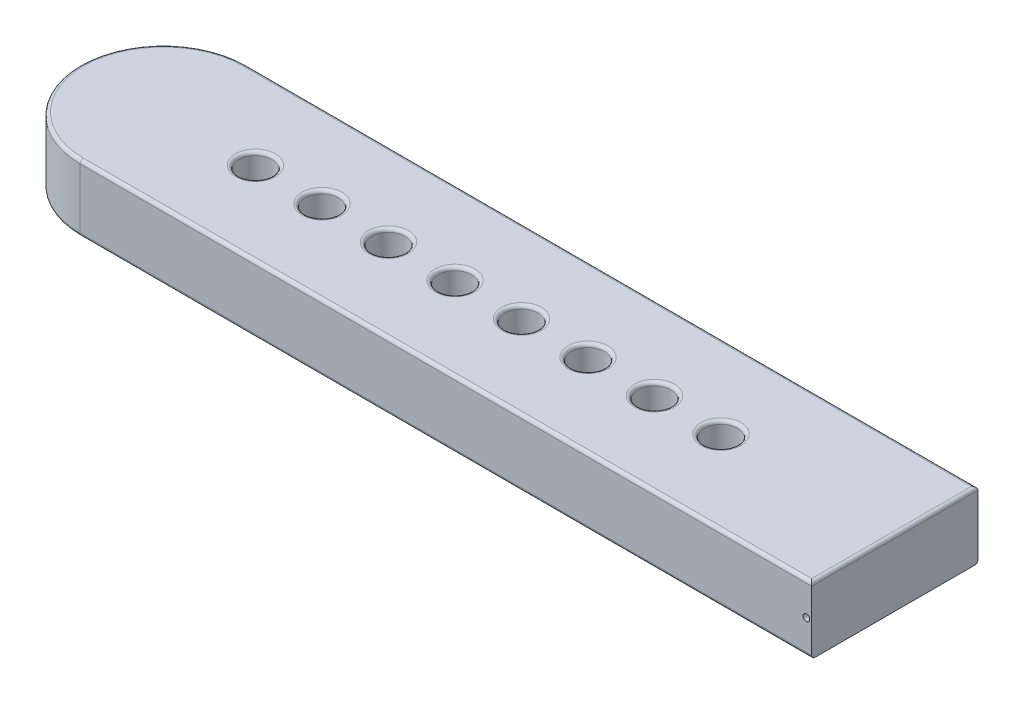
ISO-10303-21;
HEADER;
FILE_DESCRIPTION(('STEP AP214'),'2;1');
FILE_NAME('part.step','',(''),(''),'','','');
FILE_SCHEMA(('AUTOMOTIVE_DESIGN { 1 0 10303 214 1 1 1 1 }'));
ENDSEC;
DATA;
#1=APPLICATION_CONTEXT('core data for automotive mechanical design processes');
#2=APPLICATION_PROTOCOL_DEFINITION('international standard','automotive_design',2000,#1);
#3=PRODUCT_CONTEXT('',#1,'mechanical');
#4=PRODUCT('Part','Part','',(#3));
#5=PRODUCT_RELATED_PRODUCT_CATEGORY('part','',(#4));
#6=PRODUCT_DEFINITION_FORMATION('','',#4);
#7=PRODUCT_DEFINITION_CONTEXT('part definition',#1,'design');
#8=PRODUCT_DEFINITION('design','',#6,#7);
#9=PRODUCT_DEFINITION_SHAPE('','',#8);
#10=(LENGTH_UNIT() NAMED_UNIT(*) SI_UNIT(.MILLI.,.METRE.));
#11=(NAMED_UNIT(*) PLANE_ANGLE_UNIT() SI_UNIT($,.RADIAN.));
#12=(NAMED_UNIT(*) SI_UNIT($,.STERADIAN.) SOLID_ANGLE_UNIT());
#13=UNCERTAINTY_MEASURE_WITH_UNIT(LENGTH_MEASURE(1.E-05),#10,'distance_accuracy_value','');
#14=(GEOMETRIC_REPRESENTATION_CONTEXT(3) GLOBAL_UNCERTAINTY_ASSIGNED_CONTEXT((#13)) GLOBAL_UNIT_ASSIGNED_CONTEXT((#10,
#11,#12)) REPRESENTATION_CONTEXT('',''));
#15=CARTESIAN_POINT('',(0.,0.,0.));
#16=DIRECTION('',(0.,0.,1.));
#17=DIRECTION('',(1.,0.,0.));
#18=AXIS2_PLACEMENT_3D('',#15,#16,#17);
#19=CARTESIAN_POINT('',(-11.,1.,-1.25));
#20=DIRECTION('',(0.,1.,0.));
#21=DIRECTION('',(0.,0.,1.));
#22=AXIS2_PLACEMENT_3D('',#19,#20,#21);
#23=PLANE('',#22);
#24=CARTESIAN_POINT('',(-2.61511146001794,1.,-1.25));
#25=DIRECTION('',(0.,1.,0.));
#26=DIRECTION('',(0.,0.,1.));
#27=AXIS2_PLACEMENT_3D('',#24,#25,#26);
#28=CIRCLE('',#27,0.3);
#29=CARTESIAN_POINT('',(-2.61511146001794,1.,-0.95));
#30=VERTEX_POINT('',#29);
#31=EDGE_CURVE('E201',#30,#30,#28,.F.);
#32=ORIENTED_EDGE('',*,*,#31,.T.);
#33=EDGE_LOOP('',(#32));
#34=FACE_BOUND('',#33,.T.);
#35=CARTESIAN_POINT('',(-4.61511146001794,1.,-1.25));
#36=DIRECTION('',(0.,1.,0.));
#37=DIRECTION('',(0.,0.,1.));
#38=AXIS2_PLACEMENT_3D('',#35,#36,#37);
#39=CIRCLE('',#38,0.3);
#40=CARTESIAN_POINT('',(-4.61511146001794,1.,-0.95));
#41=VERTEX_POINT('',#40);
#42=EDGE_CURVE('E205',#41,#41,#39,.F.);
#43=ORIENTED_EDGE('',*,*,#42,.T.);
#44=EDGE_LOOP('',(#43));
#45=FACE_BOUND('',#44,.T.);
#46=CARTESIAN_POINT('',(-6.61511146001794,1.,-1.25));
#47=DIRECTION('',(0.,1.,0.));
#48=DIRECTION('',(0.,0.,1.));
#49=AXIS2_PLACEMENT_3D('',#46,#47,#48);
#50=CIRCLE('',#49,0.3);
#51=CARTESIAN_POINT('',(-6.61511146001794,1.,-0.95));
#52=VERTEX_POINT('',#51);
#53=EDGE_CURVE('E209',#52,#52,#50,.F.);
#54=ORIENTED_EDGE('',*,*,#53,.T.);
#55=EDGE_LOOP('',(#54));
#56=FACE_BOUND('',#55,.T.);
#57=CARTESIAN_POINT('',(-8.61511146001794,1.,-1.25));
#58=DIRECTION('',(0.,1.,0.));
#59=DIRECTION('',(0.,0.,1.));
#60=AXIS2_PLACEMENT_3D('',#57,#58,#59);
#61=CIRCLE('',#60,0.3);
#62=CARTESIAN_POINT('',(-8.61511146001794,1.,-0.95));
#63=VERTEX_POINT('',#62);
#64=EDGE_CURVE('E213',#63,#63,#61,.F.);
#65=ORIENTED_EDGE('',*,*,#64,.T.);
#66=EDGE_LOOP('',(#65));
#67=FACE_BOUND('',#66,.T.);
#68=CARTESIAN_POINT('',(-11.,1.,-1.25));
#69=DIRECTION('',(0.,1.,0.));
#70=DIRECTION('',(0.,0.,1.));
#71=AXIS2_PLACEMENT_3D('',#68,#69,#70);
#72=CIRCLE('',#71,1.2);
#73=CARTESIAN_POINT('',(-11.,1.,-2.45));
#74=VERTEX_POINT('',#73);
#75=CARTESIAN_POINT('',(-11.,1.,-0.0499999999999999));
#76=VERTEX_POINT('',#75);
#77=EDGE_CURVE('E77',#74,#76,#72,.T.);
#78=ORIENTED_EDGE('',*,*,#77,.T.);
#79=DIRECTION('',(1.,0.,0.));
#80=VECTOR('',#79,1.);
#81=CARTESIAN_POINT('',(0.,1.,-0.0499999999999999));
#82=LINE('',#81,#80);
#83=CARTESIAN_POINT('',(-0.0499999999999997,1.,-0.0499999999999999));
#84=VERTEX_POINT('',#83);
#85=EDGE_CURVE('E217',#76,#84,#82,.T.);
#86=ORIENTED_EDGE('',*,*,#85,.T.);
#87=DIRECTION('',(0.,0.,-1.));
#88=VECTOR('',#87,1.);
#89=CARTESIAN_POINT('',(-0.0499999999999997,1.,-2.5));
#90=LINE('',#89,#88);
#91=CARTESIAN_POINT('',(-0.0499999999999997,1.,-2.45));
#92=VERTEX_POINT('',#91);
#93=EDGE_CURVE('E224',#84,#92,#90,.T.);
#94=ORIENTED_EDGE('',*,*,#93,.T.);
#95=DIRECTION('',(-1.,0.,0.));
#96=VECTOR('',#95,1.);
#97=CARTESIAN_POINT('',(-11.,1.,-2.45));
#98=LINE('',#97,#96);
#99=EDGE_CURVE('E82',#92,#74,#98,.T.);
#100=ORIENTED_EDGE('',*,*,#99,.T.);
#101=EDGE_LOOP('',(#78,#86,#94,#100));
#102=FACE_BOUND('',#101,.T.);
#103=CARTESIAN_POINT('',(-9.61511146001794,1.,-1.25));
#104=DIRECTION('',(0.,1.,0.));
#105=DIRECTION('',(0.,0.,1.));
#106=AXIS2_PLACEMENT_3D('',#103,#104,#105);
#107=CIRCLE('',#106,0.3);
#108=CARTESIAN_POINT('',(-9.61511146001794,1.,-0.95));
#109=VERTEX_POINT('',#108);
#110=EDGE_CURVE('E227',#109,#109,#107,.F.);
#111=ORIENTED_EDGE('',*,*,#110,.T.);
#112=EDGE_LOOP('',(#111));
#113=FACE_BOUND('',#112,.T.);
#114=CARTESIAN_POINT('',(-7.61511146001794,1.,-1.25));
#115=DIRECTION('',(0.,1.,0.));
#116=DIRECTION('',(0.,0.,1.));
#117=AXIS2_PLACEMENT_3D('',#114,#115,#116);
#118=CIRCLE('',#117,0.3);
#119=CARTESIAN_POINT('',(-7.61511146001794,1.,-0.95));
#120=VERTEX_POINT('',#119);
#121=EDGE_CURVE('E231',#120,#120,#118,.F.);
#122=ORIENTED_EDGE('',*,*,#121,.T.);
#123=EDGE_LOOP('',(#122));
#124=FACE_BOUND('',#123,.T.);
#125=CARTESIAN_POINT('',(-5.61511146001794,1.,-1.25));
#126=DIRECTION('',(0.,1.,0.));
#127=DIRECTION('',(0.,0.,1.));
#128=AXIS2_PLACEMENT_3D('',#125,#126,#127);
#129=CIRCLE('',#128,0.3);
#130=CARTESIAN_POINT('',(-5.61511146001794,1.,-0.95));
#131=VERTEX_POINT('',#130);
#132=EDGE_CURVE('E235',#131,#131,#129,.F.);
#133=ORIENTED_EDGE('',*,*,#132,.T.);
#134=EDGE_LOOP('',(#133));
#135=FACE_BOUND('',#134,.T.);
#136=CARTESIAN_POINT('',(-3.61511146001794,1.,-1.25));
#137=DIRECTION('',(0.,1.,0.));
#138=DIRECTION('',(0.,0.,1.));
#139=AXIS2_PLACEMENT_3D('',#136,#137,#138);
#140=CIRCLE('',#139,0.3);
#141=CARTESIAN_POINT('',(-3.61511146001794,1.,-0.95));
#142=VERTEX_POINT('',#141);
#143=EDGE_CURVE('E239',#142,#142,#140,.F.);
#144=ORIENTED_EDGE('',*,*,#143,.T.);
#145=EDGE_LOOP('',(#144));
#146=FACE_BOUND('',#145,.T.);
#147=ADVANCED_FACE('F59',(#34,#45,#56,#67,#102,#113,#124,#135,#146),#23,.T.);
#148=CARTESIAN_POINT('',(-11.,0.,-1.25));
#149=DIRECTION('',(0.,1.,0.));
#150=DIRECTION('',(0.,0.,1.));
#151=AXIS2_PLACEMENT_3D('',#148,#149,#150);
#152=PLANE('',#151);
#153=CARTESIAN_POINT('',(-9.61511146001794,0.,-1.25));
#154=DIRECTION('',(0.,1.,0.));
#155=DIRECTION('',(0.,0.,1.));
#156=AXIS2_PLACEMENT_3D('',#153,#154,#155);
#157=CIRCLE('',#156,0.3);
#158=CARTESIAN_POINT('',(-9.61511146001794,0.,-0.95));
#159=VERTEX_POINT('',#158);
#160=EDGE_CURVE('E301',#159,#159,#157,.T.);
#161=ORIENTED_EDGE('',*,*,#160,.T.);
#162=EDGE_LOOP('',(#161));
#163=FACE_BOUND('',#162,.T.);
#164=CARTESIAN_POINT('',(-8.61511146001794,0.,-1.25));
#165=DIRECTION('',(0.,1.,0.));
#166=DIRECTION('',(0.,0.,1.));
#167=AXIS2_PLACEMENT_3D('',#164,#165,#166);
#168=CIRCLE('',#167,0.3);
#169=CARTESIAN_POINT('',(-8.61511146001794,0.,-0.95));
#170=VERTEX_POINT('',#169);
#171=EDGE_CURVE('E305',#170,#170,#168,.T.);
#172=ORIENTED_EDGE('',*,*,#171,.T.);
#173=EDGE_LOOP('',(#172));
#174=FACE_BOUND('',#173,.T.);
#175=CARTESIAN_POINT('',(-7.61511146001794,0.,-1.25));
#176=DIRECTION('',(0.,1.,0.));
#177=DIRECTION('',(0.,0.,1.));
#178=AXIS2_PLACEMENT_3D('',#175,#176,#177);
#179=CIRCLE('',#178,0.3);
#180=CARTESIAN_POINT('',(-7.61511146001794,0.,-0.95));
#181=VERTEX_POINT('',#180);
#182=EDGE_CURVE('E309',#181,#181,#179,.T.);
#183=ORIENTED_EDGE('',*,*,#182,.T.);
#184=EDGE_LOOP('',(#183));
#185=FACE_BOUND('',#184,.T.);
#186=CARTESIAN_POINT('',(-6.61511146001794,0.,-1.25));
#187=DIRECTION('',(0.,1.,0.));
#188=DIRECTION('',(0.,0.,1.));
#189=AXIS2_PLACEMENT_3D('',#186,#187,#188);
#190=CIRCLE('',#189,0.3);
#191=CARTESIAN_POINT('',(-6.61511146001794,0.,-0.95));
#192=VERTEX_POINT('',#191);
#193=EDGE_CURVE('E313',#192,#192,#190,.T.);
#194=ORIENTED_EDGE('',*,*,#193,.T.);
#195=EDGE_LOOP('',(#194));
#196=FACE_BOUND('',#195,.T.);
#197=CARTESIAN_POINT('',(-5.61511146001794,0.,-1.25));
#198=DIRECTION('',(0.,1.,0.));
#199=DIRECTION('',(0.,0.,1.));
#200=AXIS2_PLACEMENT_3D('',#197,#198,#199);
#201=CIRCLE('',#200,0.3);
#202=CARTESIAN_POINT('',(-5.61511146001794,0.,-0.95));
#203=VERTEX_POINT('',#202);
#204=EDGE_CURVE('E317',#203,#203,#201,.T.);
#205=ORIENTED_EDGE('',*,*,#204,.T.);
#206=EDGE_LOOP('',(#205));
#207=FACE_BOUND('',#206,.T.);
#208=CARTESIAN_POINT('',(-4.61511146001794,0.,-1.25));
#209=DIRECTION('',(0.,1.,0.));
#210=DIRECTION('',(0.,0.,1.));
#211=AXIS2_PLACEMENT_3D('',#208,#209,#210);
#212=CIRCLE('',#211,0.3);
#213=CARTESIAN_POINT('',(-4.61511146001794,0.,-0.95));
#214=VERTEX_POINT('',#213);
#215=EDGE_CURVE('E321',#214,#214,#212,.T.);
#216=ORIENTED_EDGE('',*,*,#215,.T.);
#217=EDGE_LOOP('',(#216));
#218=FACE_BOUND('',#217,.T.);
#219=CARTESIAN_POINT('',(-2.61511146001794,0.,-1.25));
#220=DIRECTION('',(0.,1.,0.));
#221=DIRECTION('',(0.,0.,1.));
#222=AXIS2_PLACEMENT_3D('',#219,#220,#221);
#223=CIRCLE('',#222,0.3);
#224=CARTESIAN_POINT('',(-2.61511146001794,0.,-0.95));
#225=VERTEX_POINT('',#224);
#226=EDGE_CURVE('E325',#225,#225,#223,.T.);
#227=ORIENTED_EDGE('',*,*,#226,.T.);
#228=EDGE_LOOP('',(#227));
#229=FACE_BOUND('',#228,.T.);
#230=CARTESIAN_POINT('',(-3.61511146001794,0.,-1.25));
#231=DIRECTION('',(0.,1.,0.));
#232=DIRECTION('',(0.,0.,1.));
#233=AXIS2_PLACEMENT_3D('',#230,#231,#232);
#234=CIRCLE('',#233,0.3);
#235=CARTESIAN_POINT('',(-3.61511146001794,0.,-0.95));
#236=VERTEX_POINT('',#235);
#237=EDGE_CURVE('E329',#236,#236,#234,.T.);
#238=ORIENTED_EDGE('',*,*,#237,.T.);
#239=EDGE_LOOP('',(#238));
#240=FACE_BOUND('',#239,.T.);
#241=CARTESIAN_POINT('',(-11.,0.,-1.25));
#242=DIRECTION('',(0.,1.,0.));
#243=DIRECTION('',(0.,0.,1.));
#244=AXIS2_PLACEMENT_3D('',#241,#242,#243);
#245=CIRCLE('',#244,1.2);
#246=CARTESIAN_POINT('',(-11.,0.,-0.05));
#247=VERTEX_POINT('',#246);
#248=CARTESIAN_POINT('',(-11.,0.,-2.45));
#249=VERTEX_POINT('',#248);
#250=EDGE_CURVE('E336',#247,#249,#245,.F.);
#251=ORIENTED_EDGE('',*,*,#250,.T.);
#252=DIRECTION('',(-1.,0.,0.));
#253=VECTOR('',#252,1.);
#254=CARTESIAN_POINT('',(-11.,0.,-2.45));
#255=LINE('',#254,#253);
#256=CARTESIAN_POINT('',(0.,0.,-2.45));
#257=VERTEX_POINT('',#256);
#258=EDGE_CURVE('E333',#249,#257,#255,.F.);
#259=ORIENTED_EDGE('',*,*,#258,.T.);
#260=DIRECTION('',(0.,0.,-1.));
#261=VECTOR('',#260,1.);
#262=CARTESIAN_POINT('',(0.,0.,0.));
#263=LINE('',#262,#261);
#264=CARTESIAN_POINT('',(0.,0.,-0.05));
#265=VERTEX_POINT('',#264);
#266=EDGE_CURVE('E182',#265,#257,#263,.T.);
#267=ORIENTED_EDGE('',*,*,#266,.F.);
#268=DIRECTION('',(1.,0.,0.));
#269=VECTOR('',#268,1.);
#270=CARTESIAN_POINT('',(-11.,0.,-0.0499999999999999));
#271=LINE('',#270,#269);
#272=EDGE_CURVE('E339',#265,#247,#271,.F.);
#273=ORIENTED_EDGE('',*,*,#272,.T.);
#274=EDGE_LOOP('',(#251,#259,#267,#273));
#275=FACE_BOUND('',#274,.T.);
#276=ADVANCED_FACE('F388',(#163,#174,#185,#196,#207,#218,#229,#240,#275),#152,.F.);
#277=CARTESIAN_POINT('',(0.,1.,0.));
#278=DIRECTION('',(-1.,0.,0.));
#279=DIRECTION('',(0.,0.,1.));
#280=AXIS2_PLACEMENT_3D('',#277,#278,#279);
#281=PLANE('',#280);
#282=ORIENTED_EDGE('',*,*,#266,.T.);
#283=CARTESIAN_POINT('',(0.,0.05,-2.45));
#284=DIRECTION('',(-1.,0.,0.));
#285=DIRECTION('',(0.,0.,1.));
#286=AXIS2_PLACEMENT_3D('',#283,#284,#285);
#287=CIRCLE('',#286,0.05);
#288=CARTESIAN_POINT('',(0.,0.05,-2.5));
#289=VERTEX_POINT('',#288);
#290=EDGE_CURVE('E292',#257,#289,#287,.F.);
#291=ORIENTED_EDGE('',*,*,#290,.T.);
#292=DIRECTION('',(0.,-1.,0.));
#293=VECTOR('',#292,1.);
#294=CARTESIAN_POINT('',(0.,1.,-2.5));
#295=LINE('',#294,#293);
#296=CARTESIAN_POINT('',(0.,0.95,-2.5));
#297=VERTEX_POINT('',#296);
#298=EDGE_CURVE('E151',#297,#289,#295,.T.);
#299=ORIENTED_EDGE('',*,*,#298,.F.);
#300=DIRECTION('',(0.,0.,-1.));
#301=VECTOR('',#300,1.);
#302=CARTESIAN_POINT('',(0.,0.95,0.));
#303=LINE('',#302,#301);
#304=CARTESIAN_POINT('',(0.,0.95,0.));
#305=VERTEX_POINT('',#304);
#306=EDGE_CURVE('E295',#297,#305,#303,.F.);
#307=ORIENTED_EDGE('',*,*,#306,.T.);
#308=DIRECTION('',(0.,-1.,0.));
#309=VECTOR('',#308,1.);
#310=CARTESIAN_POINT('',(0.,1.,0.));
#311=LINE('',#310,#309);
#312=CARTESIAN_POINT('',(0.,0.05,0.));
#313=VERTEX_POINT('',#312);
#314=EDGE_CURVE('E348',#305,#313,#311,.T.);
#315=ORIENTED_EDGE('',*,*,#314,.T.);
#316=CARTESIAN_POINT('',(0.,0.05,-0.05));
#317=DIRECTION('',(-1.,0.,0.));
#318=DIRECTION('',(0.,0.,1.));
#319=AXIS2_PLACEMENT_3D('',#316,#317,#318);
#320=CIRCLE('',#319,0.05);
#321=EDGE_CURVE('E298',#313,#265,#320,.F.);
#322=ORIENTED_EDGE('',*,*,#321,.T.);
#323=EDGE_LOOP('',(#282,#291,#299,#307,#315,#322));
#324=FACE_BOUND('',#323,.T.);
#325=ADVANCED_FACE('F422',(#324),#281,.F.);
#326=CARTESIAN_POINT('',(0.,1.,-2.5));
#327=DIRECTION('',(0.,0.,1.));
#328=DIRECTION('',(1.,0.,0.));
#329=AXIS2_PLACEMENT_3D('',#326,#327,#328);
#330=PLANE('',#329);
#331=CARTESIAN_POINT('',(-0.08,0.50222740681197,-2.5));
#332=DIRECTION('',(0.,0.,1.));
#333=DIRECTION('',(1.,0.,0.));
#334=AXIS2_PLACEMENT_3D('',#331,#332,#333);
#335=CIRCLE('',#334,0.05);
#336=CARTESIAN_POINT('',(-0.03,0.50222740681197,-2.5));
#337=VERTEX_POINT('',#336);
#338=EDGE_CURVE('E179',#337,#337,#335,.T.);
#339=ORIENTED_EDGE('',*,*,#338,.T.);
#340=EDGE_LOOP('',(#339));
#341=FACE_BOUND('',#340,.T.);
#342=ORIENTED_EDGE('',*,*,#298,.T.);
#343=DIRECTION('',(-1.,0.,0.));
#344=VECTOR('',#343,1.);
#345=CARTESIAN_POINT('',(0.,0.05,-2.5));
#346=LINE('',#345,#344);
#347=CARTESIAN_POINT('',(-11.,0.05,-2.5));
#348=VERTEX_POINT('',#347);
#349=EDGE_CURVE('E149',#289,#348,#346,.T.);
#350=ORIENTED_EDGE('',*,*,#349,.T.);
#351=DIRECTION('',(0.,-1.,0.));
#352=VECTOR('',#351,1.);
#353=CARTESIAN_POINT('',(-11.,1.,-2.5));
#354=LINE('',#353,#352);
#355=CARTESIAN_POINT('',(-11.,0.95,-2.5));
#356=VERTEX_POINT('',#355);
#357=EDGE_CURVE('E131',#356,#348,#354,.T.);
#358=ORIENTED_EDGE('',*,*,#357,.F.);
#359=DIRECTION('',(-1.,0.,0.));
#360=VECTOR('',#359,1.);
#361=CARTESIAN_POINT('',(0.,0.95,-2.5));
#362=LINE('',#361,#360);
#363=EDGE_CURVE('E146',#356,#297,#362,.F.);
#364=ORIENTED_EDGE('',*,*,#363,.T.);
#365=EDGE_LOOP('',(#342,#350,#358,#364));
#366=FACE_BOUND('',#365,.T.);
#367=ADVANCED_FACE('F145',(#341,#366),#330,.F.);
#368=CARTESIAN_POINT('',(-11.,1.,-1.25));
#369=DIRECTION('',(0.,-1.,0.));
#370=DIRECTION('',(0.,0.,-1.));
#371=AXIS2_PLACEMENT_3D('',#368,#369,#370);
#372=CYLINDRICAL_SURFACE('',#371,1.25);
#373=ORIENTED_EDGE('',*,*,#357,.T.);
#374=CARTESIAN_POINT('',(-11.,0.05,-1.25));
#375=DIRECTION('',(0.,1.,0.));
#376=DIRECTION('',(0.,0.,1.));
#377=AXIS2_PLACEMENT_3D('',#374,#375,#376);
#378=CIRCLE('',#377,1.25);
#379=CARTESIAN_POINT('',(-11.,0.05,0.));
#380=VERTEX_POINT('',#379);
#381=EDGE_CURVE('E138',#348,#380,#378,.T.);
#382=ORIENTED_EDGE('',*,*,#381,.T.);
#383=DIRECTION('',(0.,-1.,0.));
#384=VECTOR('',#383,1.);
#385=CARTESIAN_POINT('',(-11.,1.,0.));
#386=LINE('',#385,#384);
#387=CARTESIAN_POINT('',(-11.,0.95,0.));
#388=VERTEX_POINT('',#387);
#389=EDGE_CURVE('E133',#388,#380,#386,.T.);
#390=ORIENTED_EDGE('',*,*,#389,.F.);
#391=CARTESIAN_POINT('',(-11.,0.95,-1.25));
#392=DIRECTION('',(0.,1.,0.));
#393=DIRECTION('',(0.,0.,1.));
#394=AXIS2_PLACEMENT_3D('',#391,#392,#393);
#395=CIRCLE('',#394,1.25);
#396=EDGE_CURVE('E128',#388,#356,#395,.F.);
#397=ORIENTED_EDGE('',*,*,#396,.T.);
#398=EDGE_LOOP('',(#373,#382,#390,#397));
#399=FACE_BOUND('',#398,.T.);
#400=ADVANCED_FACE('F130',(#399),#372,.T.);
#401=CARTESIAN_POINT('',(-11.,1.,0.));
#402=DIRECTION('',(0.,0.,-1.));
#403=DIRECTION('',(-1.,0.,0.));
#404=AXIS2_PLACEMENT_3D('',#401,#402,#403);
#405=PLANE('',#404);
#406=CARTESIAN_POINT('',(-0.08,0.50222740681197,0.));
#407=DIRECTION('',(0.,0.,1.));
#408=DIRECTION('',(1.,0.,0.));
#409=AXIS2_PLACEMENT_3D('',#406,#407,#408);
#410=CIRCLE('',#409,0.05);
#411=CARTESIAN_POINT('',(-0.03,0.50222740681197,0.));
#412=VERTEX_POINT('',#411);
#413=EDGE_CURVE('E355',#412,#412,#410,.T.);
#414=ORIENTED_EDGE('',*,*,#413,.F.);
#415=EDGE_LOOP('',(#414));
#416=FACE_BOUND('',#415,.T.);
#417=ORIENTED_EDGE('',*,*,#314,.F.);
#418=DIRECTION('',(1.,0.,0.));
#419=VECTOR('',#418,1.);
#420=CARTESIAN_POINT('',(-11.,0.95,0.));
#421=LINE('',#420,#419);
#422=EDGE_CURVE('E187',#305,#388,#421,.F.);
#423=ORIENTED_EDGE('',*,*,#422,.T.);
#424=ORIENTED_EDGE('',*,*,#389,.T.);
#425=DIRECTION('',(1.,0.,0.));
#426=VECTOR('',#425,1.);
#427=CARTESIAN_POINT('',(-11.,0.05,0.));
#428=LINE('',#427,#426);
#429=EDGE_CURVE('E190',#380,#313,#428,.T.);
#430=ORIENTED_EDGE('',*,*,#429,.T.);
#431=EDGE_LOOP('',(#417,#423,#424,#430));
#432=FACE_BOUND('',#431,.T.);
#433=ADVANCED_FACE('F371',(#416,#432),#405,.F.);
#434=CARTESIAN_POINT('',(-9.61511146001794,1.,-1.25));
#435=DIRECTION('',(0.,-1.,0.));
#436=DIRECTION('',(0.,0.,-1.));
#437=AXIS2_PLACEMENT_3D('',#434,#435,#436);
#438=CYLINDRICAL_SURFACE('',#437,0.25);
#439=CARTESIAN_POINT('',(-9.61511146001794,0.05,-1.25));
#440=DIRECTION('',(0.,1.,0.));
#441=DIRECTION('',(0.,0.,1.));
#442=AXIS2_PLACEMENT_3D('',#439,#440,#441);
#443=CIRCLE('',#442,0.25);
#444=CARTESIAN_POINT('',(-9.61511146001794,0.05,-1.));
#445=VERTEX_POINT('',#444);
#446=EDGE_CURVE('E284',#445,#445,#443,.F.);
#447=ORIENTED_EDGE('',*,*,#446,.T.);
#448=EDGE_LOOP('',(#447));
#449=FACE_BOUND('',#448,.T.);
#450=CARTESIAN_POINT('',(-9.61511146001794,0.95,-1.25));
#451=DIRECTION('',(0.,1.,0.));
#452=DIRECTION('',(0.,0.,1.));
#453=AXIS2_PLACEMENT_3D('',#450,#451,#452);
#454=CIRCLE('',#453,0.25);
#455=CARTESIAN_POINT('',(-9.61511146001794,0.95,-1.));
#456=VERTEX_POINT('',#455);
#457=EDGE_CURVE('E288',#456,#456,#454,.T.);
#458=ORIENTED_EDGE('',*,*,#457,.T.);
#459=EDGE_LOOP('',(#458));
#460=FACE_BOUND('',#459,.T.);
#461=ADVANCED_FACE('F374',(#449,#460),#438,.F.);
#462=CARTESIAN_POINT('',(-8.61511146001794,1.,-1.25));
#463=DIRECTION('',(0.,-1.,0.));
#464=DIRECTION('',(0.,0.,-1.));
#465=AXIS2_PLACEMENT_3D('',#462,#463,#464);
#466=CYLINDRICAL_SURFACE('',#465,0.25);
#467=CARTESIAN_POINT('',(-8.61511146001794,0.05,-1.25));
#468=DIRECTION('',(0.,1.,0.));
#469=DIRECTION('',(0.,0.,1.));
#470=AXIS2_PLACEMENT_3D('',#467,#468,#469);
#471=CIRCLE('',#470,0.25);
#472=CARTESIAN_POINT('',(-8.61511146001794,0.05,-1.));
#473=VERTEX_POINT('',#472);
#474=EDGE_CURVE('E276',#473,#473,#471,.F.);
#475=ORIENTED_EDGE('',*,*,#474,.T.);
#476=EDGE_LOOP('',(#475));
#477=FACE_BOUND('',#476,.T.);
#478=CARTESIAN_POINT('',(-8.61511146001794,0.95,-1.25));
#479=DIRECTION('',(0.,1.,0.));
#480=DIRECTION('',(0.,0.,1.));
#481=AXIS2_PLACEMENT_3D('',#478,#479,#480);
#482=CIRCLE('',#481,0.25);
#483=CARTESIAN_POINT('',(-8.61511146001794,0.95,-1.));
#484=VERTEX_POINT('',#483);
#485=EDGE_CURVE('E280',#484,#484,#482,.T.);
#486=ORIENTED_EDGE('',*,*,#485,.T.);
#487=EDGE_LOOP('',(#486));
#488=FACE_BOUND('',#487,.T.);
#489=ADVANCED_FACE('F540',(#477,#488),#466,.F.);
#490=CARTESIAN_POINT('',(-7.61511146001794,1.,-1.25));
#491=DIRECTION('',(0.,-1.,0.));
#492=DIRECTION('',(0.,0.,-1.));
#493=AXIS2_PLACEMENT_3D('',#490,#491,#492);
#494=CYLINDRICAL_SURFACE('',#493,0.25);
#495=CARTESIAN_POINT('',(-7.61511146001794,0.05,-1.25));
#496=DIRECTION('',(0.,1.,0.));
#497=DIRECTION('',(0.,0.,1.));
#498=AXIS2_PLACEMENT_3D('',#495,#496,#497);
#499=CIRCLE('',#498,0.25);
#500=CARTESIAN_POINT('',(-7.61511146001794,0.05,-1.));
#501=VERTEX_POINT('',#500);
#502=EDGE_CURVE('E268',#501,#501,#499,.F.);
#503=ORIENTED_EDGE('',*,*,#502,.T.);
#504=EDGE_LOOP('',(#503));
#505=FACE_BOUND('',#504,.T.);
#506=CARTESIAN_POINT('',(-7.61511146001794,0.95,-1.25));
#507=DIRECTION('',(0.,1.,0.));
#508=DIRECTION('',(0.,0.,1.));
#509=AXIS2_PLACEMENT_3D('',#506,#507,#508);
#510=CIRCLE('',#509,0.25);
#511=CARTESIAN_POINT('',(-7.61511146001794,0.95,-1.));
#512=VERTEX_POINT('',#511);
#513=EDGE_CURVE('E272',#512,#512,#510,.T.);
#514=ORIENTED_EDGE('',*,*,#513,.T.);
#515=EDGE_LOOP('',(#514));
#516=FACE_BOUND('',#515,.T.);
#517=ADVANCED_FACE('F536',(#505,#516),#494,.F.);
#518=CARTESIAN_POINT('',(-6.61511146001794,1.,-1.25));
#519=DIRECTION('',(0.,-1.,0.));
#520=DIRECTION('',(0.,0.,-1.));
#521=AXIS2_PLACEMENT_3D('',#518,#519,#520);
#522=CYLINDRICAL_SURFACE('',#521,0.25);
#523=CARTESIAN_POINT('',(-6.61511146001794,0.05,-1.25));
#524=DIRECTION('',(0.,1.,0.));
#525=DIRECTION('',(0.,0.,1.));
#526=AXIS2_PLACEMENT_3D('',#523,#524,#525);
#527=CIRCLE('',#526,0.25);
#528=CARTESIAN_POINT('',(-6.61511146001794,0.05,-1.));
#529=VERTEX_POINT('',#528);
#530=EDGE_CURVE('E260',#529,#529,#527,.F.);
#531=ORIENTED_EDGE('',*,*,#530,.T.);
#532=EDGE_LOOP('',(#531));
#533=FACE_BOUND('',#532,.T.);
#534=CARTESIAN_POINT('',(-6.61511146001794,0.95,-1.25));
#535=DIRECTION('',(0.,1.,0.));
#536=DIRECTION('',(0.,0.,1.));
#537=AXIS2_PLACEMENT_3D('',#534,#535,#536);
#538=CIRCLE('',#537,0.25);
#539=CARTESIAN_POINT('',(-6.61511146001794,0.95,-1.));
#540=VERTEX_POINT('',#539);
#541=EDGE_CURVE('E264',#540,#540,#538,.T.);
#542=ORIENTED_EDGE('',*,*,#541,.T.);
#543=EDGE_LOOP('',(#542));
#544=FACE_BOUND('',#543,.T.);
#545=ADVANCED_FACE('F532',(#533,#544),#522,.F.);
#546=CARTESIAN_POINT('',(-5.61511146001794,1.,-1.25));
#547=DIRECTION('',(0.,-1.,0.));
#548=DIRECTION('',(0.,0.,-1.));
#549=AXIS2_PLACEMENT_3D('',#546,#547,#548);
#550=CYLINDRICAL_SURFACE('',#549,0.25);
#551=CARTESIAN_POINT('',(-5.61511146001794,0.05,-1.25));
#552=DIRECTION('',(0.,1.,0.));
#553=DIRECTION('',(0.,0.,1.));
#554=AXIS2_PLACEMENT_3D('',#551,#552,#553);
#555=CIRCLE('',#554,0.25);
#556=CARTESIAN_POINT('',(-5.61511146001794,0.05,-1.));
#557=VERTEX_POINT('',#556);
#558=EDGE_CURVE('E139',#557,#557,#555,.F.);
#559=ORIENTED_EDGE('',*,*,#558,.T.);
#560=EDGE_LOOP('',(#559));
#561=FACE_BOUND('',#560,.T.);
#562=CARTESIAN_POINT('',(-5.61511146001794,0.95,-1.25));
#563=DIRECTION('',(0.,1.,0.));
#564=DIRECTION('',(0.,0.,1.));
#565=AXIS2_PLACEMENT_3D('',#562,#563,#564);
#566=CIRCLE('',#565,0.25);
#567=CARTESIAN_POINT('',(-5.61511146001794,0.95,-1.));
#568=VERTEX_POINT('',#567);
#569=EDGE_CURVE('E256',#568,#568,#566,.T.);
#570=ORIENTED_EDGE('',*,*,#569,.T.);
#571=EDGE_LOOP('',(#570));
#572=FACE_BOUND('',#571,.T.);
#573=ADVANCED_FACE('F528',(#561,#572),#550,.F.);
#574=CARTESIAN_POINT('',(-4.61511146001794,1.,-1.25));
#575=DIRECTION('',(0.,-1.,0.));
#576=DIRECTION('',(0.,0.,-1.));
#577=AXIS2_PLACEMENT_3D('',#574,#575,#576);
#578=CYLINDRICAL_SURFACE('',#577,0.25);
#579=CARTESIAN_POINT('',(-4.61511146001794,0.95,-1.25));
#580=DIRECTION('',(0.,1.,0.));
#581=DIRECTION('',(0.,0.,1.));
#582=AXIS2_PLACEMENT_3D('',#579,#580,#581);
#583=CIRCLE('',#582,0.25);
#584=CARTESIAN_POINT('',(-4.61511146001794,0.95,-1.));
#585=VERTEX_POINT('',#584);
#586=EDGE_CURVE('E193',#585,#585,#583,.T.);
#587=ORIENTED_EDGE('',*,*,#586,.T.);
#588=EDGE_LOOP('',(#587));
#589=FACE_BOUND('',#588,.T.);
#590=CARTESIAN_POINT('',(-4.61511146001794,0.05,-1.25));
#591=DIRECTION('',(0.,1.,0.));
#592=DIRECTION('',(0.,0.,1.));
#593=AXIS2_PLACEMENT_3D('',#590,#591,#592);
#594=CIRCLE('',#593,0.25);
#595=CARTESIAN_POINT('',(-4.61511146001794,0.05,-1.));
#596=VERTEX_POINT('',#595);
#597=EDGE_CURVE('E197',#596,#596,#594,.F.);
#598=ORIENTED_EDGE('',*,*,#597,.T.);
#599=EDGE_LOOP('',(#598));
#600=FACE_BOUND('',#599,.T.);
#601=ADVANCED_FACE('F411',(#589,#600),#578,.F.);
#602=CARTESIAN_POINT('',(-3.61511146001794,1.,-1.25));
#603=DIRECTION('',(0.,-1.,0.));
#604=DIRECTION('',(0.,0.,-1.));
#605=AXIS2_PLACEMENT_3D('',#602,#603,#604);
#606=CYLINDRICAL_SURFACE('',#605,0.25);
#607=CARTESIAN_POINT('',(-3.61511146001794,0.95,-1.25));
#608=DIRECTION('',(0.,1.,0.));
#609=DIRECTION('',(0.,0.,1.));
#610=AXIS2_PLACEMENT_3D('',#607,#608,#609);
#611=CIRCLE('',#610,0.25);
#612=CARTESIAN_POINT('',(-3.61511146001794,0.95,-1.));
#613=VERTEX_POINT('',#612);
#614=EDGE_CURVE('E13',#613,#613,#611,.T.);
#615=ORIENTED_EDGE('',*,*,#614,.T.);
#616=EDGE_LOOP('',(#615));
#617=FACE_BOUND('',#616,.T.);
#618=CARTESIAN_POINT('',(-3.61511146001794,0.05,-1.25));
#619=DIRECTION('',(0.,1.,0.));
#620=DIRECTION('',(0.,0.,1.));
#621=AXIS2_PLACEMENT_3D('',#618,#619,#620);
#622=CIRCLE('',#621,0.25);
#623=CARTESIAN_POINT('',(-3.61511146001794,0.05,-1.));
#624=VERTEX_POINT('',#623);
#625=EDGE_CURVE('E69',#624,#624,#622,.F.);
#626=ORIENTED_EDGE('',*,*,#625,.T.);
#627=EDGE_LOOP('',(#626));
#628=FACE_BOUND('',#627,.T.);
#629=ADVANCED_FACE('F407',(#617,#628),#606,.F.);
#630=CARTESIAN_POINT('',(-2.61511146001794,1.,-1.25));
#631=DIRECTION('',(0.,-1.,0.));
#632=DIRECTION('',(0.,0.,-1.));
#633=AXIS2_PLACEMENT_3D('',#630,#631,#632);
#634=CYLINDRICAL_SURFACE('',#633,0.25);
#635=CARTESIAN_POINT('',(-2.61511146001794,0.95,-1.25));
#636=DIRECTION('',(0.,1.,0.));
#637=DIRECTION('',(0.,0.,1.));
#638=AXIS2_PLACEMENT_3D('',#635,#636,#637);
#639=CIRCLE('',#638,0.25);
#640=CARTESIAN_POINT('',(-2.61511146001794,0.95,-1.));
#641=VERTEX_POINT('',#640);
#642=EDGE_CURVE('E243',#641,#641,#639,.T.);
#643=ORIENTED_EDGE('',*,*,#642,.T.);
#644=EDGE_LOOP('',(#643));
#645=FACE_BOUND('',#644,.T.);
#646=CARTESIAN_POINT('',(-2.61511146001794,0.05,-1.25));
#647=DIRECTION('',(0.,1.,0.));
#648=DIRECTION('',(0.,0.,1.));
#649=AXIS2_PLACEMENT_3D('',#646,#647,#648);
#650=CIRCLE('',#649,0.25);
#651=CARTESIAN_POINT('',(-2.61511146001794,0.05,-1.));
#652=VERTEX_POINT('',#651);
#653=EDGE_CURVE('E247',#652,#652,#650,.F.);
#654=ORIENTED_EDGE('',*,*,#653,.T.);
#655=EDGE_LOOP('',(#654));
#656=FACE_BOUND('',#655,.T.);
#657=ADVANCED_FACE('F410',(#645,#656),#634,.F.);
#658=CARTESIAN_POINT('',(-11.,0.05,-0.05));
#659=DIRECTION('',(1.,0.,0.));
#660=DIRECTION('',(0.,0.,-1.));
#661=AXIS2_PLACEMENT_3D('',#658,#659,#660);
#662=CYLINDRICAL_SURFACE('',#661,0.05);
#663=ORIENTED_EDGE('',*,*,#321,.F.);
#664=ORIENTED_EDGE('',*,*,#429,.F.);
#665=CARTESIAN_POINT('',(-11.,0.05,-0.05));
#666=DIRECTION('',(-1.,0.,0.));
#667=DIRECTION('',(0.,0.,1.));
#668=AXIS2_PLACEMENT_3D('',#665,#666,#667);
#669=CIRCLE('',#668,0.05);
#670=EDGE_CURVE('E167',#247,#380,#669,.T.);
#671=ORIENTED_EDGE('',*,*,#670,.F.);
#672=ORIENTED_EDGE('',*,*,#272,.F.);
#673=EDGE_LOOP('',(#663,#664,#671,#672));
#674=FACE_BOUND('',#673,.T.);
#675=ADVANCED_FACE('F438',(#674),#662,.T.);
#676=CARTESIAN_POINT('',(-11.,0.05,-1.25));
#677=DIRECTION('',(0.,1.,0.));
#678=DIRECTION('',(0.,0.,1.));
#679=AXIS2_PLACEMENT_3D('',#676,#677,#678);
#680=TOROIDAL_SURFACE('',#679,1.2,0.05);
#681=ORIENTED_EDGE('',*,*,#670,.T.);
#682=ORIENTED_EDGE('',*,*,#381,.F.);
#683=CARTESIAN_POINT('',(-11.,0.05,-2.45));
#684=DIRECTION('',(1.,0.,0.));
#685=DIRECTION('',(0.,0.,-1.));
#686=AXIS2_PLACEMENT_3D('',#683,#684,#685);
#687=CIRCLE('',#686,0.05);
#688=EDGE_CURVE('E163',#249,#348,#687,.T.);
#689=ORIENTED_EDGE('',*,*,#688,.F.);
#690=ORIENTED_EDGE('',*,*,#250,.F.);
#691=EDGE_LOOP('',(#681,#682,#689,#690));
#692=FACE_BOUND('',#691,.T.);
#693=ADVANCED_FACE('F436',(#692),#680,.T.);
#694=CARTESIAN_POINT('',(0.,0.05,-2.45));
#695=DIRECTION('',(-1.,0.,0.));
#696=DIRECTION('',(0.,0.,1.));
#697=AXIS2_PLACEMENT_3D('',#694,#695,#696);
#698=CYLINDRICAL_SURFACE('',#697,0.05);
#699=ORIENTED_EDGE('',*,*,#290,.F.);
#700=ORIENTED_EDGE('',*,*,#258,.F.);
#701=ORIENTED_EDGE('',*,*,#688,.T.);
#702=ORIENTED_EDGE('',*,*,#349,.F.);
#703=EDGE_LOOP('',(#699,#700,#701,#702));
#704=FACE_BOUND('',#703,.T.);
#705=ADVANCED_FACE('F434',(#704),#698,.T.);
#706=CARTESIAN_POINT('',(-9.61511146001794,0.05,-1.25));
#707=DIRECTION('',(0.,1.,0.));
#708=DIRECTION('',(0.,0.,1.));
#709=AXIS2_PLACEMENT_3D('',#706,#707,#708);
#710=TOROIDAL_SURFACE('',#709,0.3,0.05);
#711=ORIENTED_EDGE('',*,*,#446,.F.);
#712=EDGE_LOOP('',(#711));
#713=FACE_BOUND('',#712,.T.);
#714=ORIENTED_EDGE('',*,*,#160,.F.);
#715=EDGE_LOOP('',(#714));
#716=FACE_BOUND('',#715,.T.);
#717=ADVANCED_FACE('F450',(#713,#716),#710,.T.);
#718=CARTESIAN_POINT('',(-8.61511146001794,0.05,-1.25));
#719=DIRECTION('',(0.,1.,0.));
#720=DIRECTION('',(0.,0.,1.));
#721=AXIS2_PLACEMENT_3D('',#718,#719,#720);
#722=TOROIDAL_SURFACE('',#721,0.3,0.05);
#723=ORIENTED_EDGE('',*,*,#474,.F.);
#724=EDGE_LOOP('',(#723));
#725=FACE_BOUND('',#724,.T.);
#726=ORIENTED_EDGE('',*,*,#171,.F.);
#727=EDGE_LOOP('',(#726));
#728=FACE_BOUND('',#727,.T.);
#729=ADVANCED_FACE('F457',(#725,#728),#722,.T.);
#730=CARTESIAN_POINT('',(-7.61511146001794,0.05,-1.25));
#731=DIRECTION('',(0.,1.,0.));
#732=DIRECTION('',(0.,0.,1.));
#733=AXIS2_PLACEMENT_3D('',#730,#731,#732);
#734=TOROIDAL_SURFACE('',#733,0.3,0.05);
#735=ORIENTED_EDGE('',*,*,#502,.F.);
#736=EDGE_LOOP('',(#735));
#737=FACE_BOUND('',#736,.T.);
#738=ORIENTED_EDGE('',*,*,#182,.F.);
#739=EDGE_LOOP('',(#738));
#740=FACE_BOUND('',#739,.T.);
#741=ADVANCED_FACE('F461',(#737,#740),#734,.T.);
#742=CARTESIAN_POINT('',(-6.61511146001794,0.05,-1.25));
#743=DIRECTION('',(0.,1.,0.));
#744=DIRECTION('',(0.,0.,1.));
#745=AXIS2_PLACEMENT_3D('',#742,#743,#744);
#746=TOROIDAL_SURFACE('',#745,0.3,0.05);
#747=ORIENTED_EDGE('',*,*,#530,.F.);
#748=EDGE_LOOP('',(#747));
#749=FACE_BOUND('',#748,.T.);
#750=ORIENTED_EDGE('',*,*,#193,.F.);
#751=EDGE_LOOP('',(#750));
#752=FACE_BOUND('',#751,.T.);
#753=ADVANCED_FACE('F465',(#749,#752),#746,.T.);
#754=CARTESIAN_POINT('',(-5.61511146001794,0.05,-1.25));
#755=DIRECTION('',(0.,1.,0.));
#756=DIRECTION('',(0.,0.,1.));
#757=AXIS2_PLACEMENT_3D('',#754,#755,#756);
#758=TOROIDAL_SURFACE('',#757,0.3,0.05);
#759=ORIENTED_EDGE('',*,*,#558,.F.);
#760=EDGE_LOOP('',(#759));
#761=FACE_BOUND('',#760,.T.);
#762=ORIENTED_EDGE('',*,*,#204,.F.);
#763=EDGE_LOOP('',(#762));
#764=FACE_BOUND('',#763,.T.);
#765=ADVANCED_FACE('F469',(#761,#764),#758,.T.);
#766=CARTESIAN_POINT('',(-2.61511146001794,0.95,-1.25));
#767=DIRECTION('',(0.,1.,0.));
#768=DIRECTION('',(0.,0.,1.));
#769=AXIS2_PLACEMENT_3D('',#766,#767,#768);
#770=TOROIDAL_SURFACE('',#769,0.3,0.05);
#771=ORIENTED_EDGE('',*,*,#31,.F.);
#772=EDGE_LOOP('',(#771));
#773=FACE_BOUND('',#772,.T.);
#774=ORIENTED_EDGE('',*,*,#642,.F.);
#775=EDGE_LOOP('',(#774));
#776=FACE_BOUND('',#775,.T.);
#777=ADVANCED_FACE('F473',(#773,#776),#770,.T.);
#778=CARTESIAN_POINT('',(-4.61511146001794,0.95,-1.25));
#779=DIRECTION('',(0.,1.,0.));
#780=DIRECTION('',(0.,0.,1.));
#781=AXIS2_PLACEMENT_3D('',#778,#779,#780);
#782=TOROIDAL_SURFACE('',#781,0.3,0.05);
#783=ORIENTED_EDGE('',*,*,#42,.F.);
#784=EDGE_LOOP('',(#783));
#785=FACE_BOUND('',#784,.T.);
#786=ORIENTED_EDGE('',*,*,#586,.F.);
#787=EDGE_LOOP('',(#786));
#788=FACE_BOUND('',#787,.T.);
#789=ADVANCED_FACE('F477',(#785,#788),#782,.T.);
#790=CARTESIAN_POINT('',(-6.61511146001794,0.95,-1.25));
#791=DIRECTION('',(0.,1.,0.));
#792=DIRECTION('',(0.,0.,1.));
#793=AXIS2_PLACEMENT_3D('',#790,#791,#792);
#794=TOROIDAL_SURFACE('',#793,0.3,0.05);
#795=ORIENTED_EDGE('',*,*,#53,.F.);
#796=EDGE_LOOP('',(#795));
#797=FACE_BOUND('',#796,.T.);
#798=ORIENTED_EDGE('',*,*,#541,.F.);
#799=EDGE_LOOP('',(#798));
#800=FACE_BOUND('',#799,.T.);
#801=ADVANCED_FACE('F481',(#797,#800),#794,.T.);
#802=CARTESIAN_POINT('',(-8.61511146001794,0.95,-1.25));
#803=DIRECTION('',(0.,1.,0.));
#804=DIRECTION('',(0.,0.,1.));
#805=AXIS2_PLACEMENT_3D('',#802,#803,#804);
#806=TOROIDAL_SURFACE('',#805,0.3,0.05);
#807=ORIENTED_EDGE('',*,*,#64,.F.);
#808=EDGE_LOOP('',(#807));
#809=FACE_BOUND('',#808,.T.);
#810=ORIENTED_EDGE('',*,*,#485,.F.);
#811=EDGE_LOOP('',(#810));
#812=FACE_BOUND('',#811,.T.);
#813=ADVANCED_FACE('F485',(#809,#812),#806,.T.);
#814=CARTESIAN_POINT('',(-11.,0.95,-2.45));
#815=DIRECTION('',(1.,0.,0.));
#816=DIRECTION('',(0.,0.,-1.));
#817=AXIS2_PLACEMENT_3D('',#814,#815,#816);
#818=CYLINDRICAL_SURFACE('',#817,0.05);
#819=CARTESIAN_POINT('',(-0.0499999999999997,0.95,-2.45));
#820=DIRECTION('',(0.707106781186548,0.,0.707106781186547));
#821=DIRECTION('',(-0.707106781186547,0.,0.707106781186548));
#822=AXIS2_PLACEMENT_3D('',#819,#820,#821);
#823=ELLIPSE('',#822,0.0707106781186548,0.05);
#824=EDGE_CURVE('E157',#297,#92,#823,.T.);
#825=ORIENTED_EDGE('',*,*,#824,.F.);
#826=ORIENTED_EDGE('',*,*,#363,.F.);
#827=CARTESIAN_POINT('',(-11.,0.95,-2.45));
#828=DIRECTION('',(-1.,0.,0.));
#829=DIRECTION('',(0.,0.,1.));
#830=AXIS2_PLACEMENT_3D('',#827,#828,#829);
#831=CIRCLE('',#830,0.05);
#832=EDGE_CURVE('E63',#74,#356,#831,.T.);
#833=ORIENTED_EDGE('',*,*,#832,.F.);
#834=ORIENTED_EDGE('',*,*,#99,.F.);
#835=EDGE_LOOP('',(#825,#826,#833,#834));
#836=FACE_BOUND('',#835,.T.);
#837=ADVANCED_FACE('F155',(#836),#818,.T.);
#838=CARTESIAN_POINT('',(-11.,0.95,-1.25));
#839=DIRECTION('',(0.,1.,0.));
#840=DIRECTION('',(0.,0.,1.));
#841=AXIS2_PLACEMENT_3D('',#838,#839,#840);
#842=TOROIDAL_SURFACE('',#841,1.2,0.05);
#843=ORIENTED_EDGE('',*,*,#832,.T.);
#844=ORIENTED_EDGE('',*,*,#396,.F.);
#845=CARTESIAN_POINT('',(-11.,0.95,-0.0499999999999999));
#846=DIRECTION('',(1.,0.,0.));
#847=DIRECTION('',(0.,0.,-1.));
#848=AXIS2_PLACEMENT_3D('',#845,#846,#847);
#849=CIRCLE('',#848,0.05);
#850=EDGE_CURVE('E169',#76,#388,#849,.T.);
#851=ORIENTED_EDGE('',*,*,#850,.F.);
#852=ORIENTED_EDGE('',*,*,#77,.F.);
#853=EDGE_LOOP('',(#843,#844,#851,#852));
#854=FACE_BOUND('',#853,.T.);
#855=ADVANCED_FACE('F161',(#854),#842,.T.);
#856=CARTESIAN_POINT('',(-0.0499999999999997,0.95,-1.25));
#857=DIRECTION('',(0.,0.,1.));
#858=DIRECTION('',(1.,0.,0.));
#859=AXIS2_PLACEMENT_3D('',#856,#857,#858);
#860=CYLINDRICAL_SURFACE('',#859,0.05);
#861=ORIENTED_EDGE('',*,*,#824,.T.);
#862=ORIENTED_EDGE('',*,*,#93,.F.);
#863=CARTESIAN_POINT('',(-0.0499999999999997,0.95,-0.0499999999999999));
#864=DIRECTION('',(-0.707106781186547,0.,0.707106781186547));
#865=DIRECTION('',(0.707106781186547,0.,0.707106781186547));
#866=AXIS2_PLACEMENT_3D('',#863,#864,#865);
#867=ELLIPSE('',#866,0.0707106781186548,0.05);
#868=EDGE_CURVE('E174',#305,#84,#867,.T.);
#869=ORIENTED_EDGE('',*,*,#868,.F.);
#870=ORIENTED_EDGE('',*,*,#306,.F.);
#871=EDGE_LOOP('',(#861,#862,#869,#870));
#872=FACE_BOUND('',#871,.T.);
#873=ADVANCED_FACE('F385',(#872),#860,.T.);
#874=CARTESIAN_POINT('',(-11.,0.95,-0.0499999999999999));
#875=DIRECTION('',(-1.,0.,0.));
#876=DIRECTION('',(0.,0.,1.));
#877=AXIS2_PLACEMENT_3D('',#874,#875,#876);
#878=CYLINDRICAL_SURFACE('',#877,0.05);
#879=ORIENTED_EDGE('',*,*,#850,.T.);
#880=ORIENTED_EDGE('',*,*,#422,.F.);
#881=ORIENTED_EDGE('',*,*,#868,.T.);
#882=ORIENTED_EDGE('',*,*,#85,.F.);
#883=EDGE_LOOP('',(#879,#880,#881,#882));
#884=FACE_BOUND('',#883,.T.);
#885=ADVANCED_FACE('F383',(#884),#878,.T.);
#886=CARTESIAN_POINT('',(-9.61511146001794,0.95,-1.25));
#887=DIRECTION('',(0.,1.,0.));
#888=DIRECTION('',(0.,0.,1.));
#889=AXIS2_PLACEMENT_3D('',#886,#887,#888);
#890=TOROIDAL_SURFACE('',#889,0.3,0.05);
#891=ORIENTED_EDGE('',*,*,#110,.F.);
#892=EDGE_LOOP('',(#891));
#893=FACE_BOUND('',#892,.T.);
#894=ORIENTED_EDGE('',*,*,#457,.F.);
#895=EDGE_LOOP('',(#894));
#896=FACE_BOUND('',#895,.T.);
#897=ADVANCED_FACE('F492',(#893,#896),#890,.T.);
#898=CARTESIAN_POINT('',(-7.61511146001794,0.95,-1.25));
#899=DIRECTION('',(0.,1.,0.));
#900=DIRECTION('',(0.,0.,1.));
#901=AXIS2_PLACEMENT_3D('',#898,#899,#900);
#902=TOROIDAL_SURFACE('',#901,0.3,0.05);
#903=ORIENTED_EDGE('',*,*,#121,.F.);
#904=EDGE_LOOP('',(#903));
#905=FACE_BOUND('',#904,.T.);
#906=ORIENTED_EDGE('',*,*,#513,.F.);
#907=EDGE_LOOP('',(#906));
#908=FACE_BOUND('',#907,.T.);
#909=ADVANCED_FACE('F501',(#905,#908),#902,.T.);
#910=CARTESIAN_POINT('',(-5.61511146001794,0.95,-1.25));
#911=DIRECTION('',(0.,1.,0.));
#912=DIRECTION('',(0.,0.,1.));
#913=AXIS2_PLACEMENT_3D('',#910,#911,#912);
#914=TOROIDAL_SURFACE('',#913,0.3,0.05);
#915=ORIENTED_EDGE('',*,*,#132,.F.);
#916=EDGE_LOOP('',(#915));
#917=FACE_BOUND('',#916,.T.);
#918=ORIENTED_EDGE('',*,*,#569,.F.);
#919=EDGE_LOOP('',(#918));
#920=FACE_BOUND('',#919,.T.);
#921=ADVANCED_FACE('F403',(#917,#920),#914,.T.);
#922=CARTESIAN_POINT('',(-3.61511146001794,0.95,-1.25));
#923=DIRECTION('',(0.,1.,0.));
#924=DIRECTION('',(0.,0.,1.));
#925=AXIS2_PLACEMENT_3D('',#922,#923,#924);
#926=TOROIDAL_SURFACE('',#925,0.3,0.05);
#927=ORIENTED_EDGE('',*,*,#143,.F.);
#928=EDGE_LOOP('',(#927));
#929=FACE_BOUND('',#928,.T.);
#930=ORIENTED_EDGE('',*,*,#614,.F.);
#931=EDGE_LOOP('',(#930));
#932=FACE_BOUND('',#931,.T.);
#933=ADVANCED_FACE('F399',(#929,#932),#926,.T.);
#934=CARTESIAN_POINT('',(-4.61511146001794,0.05,-1.25));
#935=DIRECTION('',(0.,1.,0.));
#936=DIRECTION('',(0.,0.,1.));
#937=AXIS2_PLACEMENT_3D('',#934,#935,#936);
#938=TOROIDAL_SURFACE('',#937,0.3,0.05);
#939=ORIENTED_EDGE('',*,*,#597,.F.);
#940=EDGE_LOOP('',(#939));
#941=FACE_BOUND('',#940,.T.);
#942=ORIENTED_EDGE('',*,*,#215,.F.);
#943=EDGE_LOOP('',(#942));
#944=FACE_BOUND('',#943,.T.);
#945=ADVANCED_FACE('F402',(#941,#944),#938,.T.);
#946=CARTESIAN_POINT('',(-2.61511146001794,0.05,-1.25));
#947=DIRECTION('',(0.,1.,0.));
#948=DIRECTION('',(0.,0.,1.));
#949=AXIS2_PLACEMENT_3D('',#946,#947,#948);
#950=TOROIDAL_SURFACE('',#949,0.3,0.05);
#951=ORIENTED_EDGE('',*,*,#653,.F.);
#952=EDGE_LOOP('',(#951));
#953=FACE_BOUND('',#952,.T.);
#954=ORIENTED_EDGE('',*,*,#226,.F.);
#955=EDGE_LOOP('',(#954));
#956=FACE_BOUND('',#955,.T.);
#957=ADVANCED_FACE('F417',(#953,#956),#950,.T.);
#958=CARTESIAN_POINT('',(-3.61511146001794,0.05,-1.25));
#959=DIRECTION('',(0.,1.,0.));
#960=DIRECTION('',(0.,0.,1.));
#961=AXIS2_PLACEMENT_3D('',#958,#959,#960);
#962=TOROIDAL_SURFACE('',#961,0.3,0.05);
#963=ORIENTED_EDGE('',*,*,#625,.F.);
#964=EDGE_LOOP('',(#963));
#965=FACE_BOUND('',#964,.T.);
#966=ORIENTED_EDGE('',*,*,#237,.F.);
#967=EDGE_LOOP('',(#966));
#968=FACE_BOUND('',#967,.T.);
#969=ADVANCED_FACE('F61',(#965,#968),#962,.T.);
#970=CARTESIAN_POINT('',(-0.08,0.50222740681197,-2.5));
#971=DIRECTION('',(0.,0.,1.));
#972=DIRECTION('',(1.,0.,0.));
#973=AXIS2_PLACEMENT_3D('',#970,#971,#972);
#974=CYLINDRICAL_SURFACE('',#973,0.05);
#975=ORIENTED_EDGE('',*,*,#338,.F.);
#976=EDGE_LOOP('',(#975));
#977=FACE_BOUND('',#976,.T.);
#978=ORIENTED_EDGE('',*,*,#413,.T.);
#979=EDGE_LOOP('',(#978));
#980=FACE_BOUND('',#979,.T.);
#981=ADVANCED_FACE('F365',(#977,#980),#974,.F.);
#982=CLOSED_SHELL('',(#147,#276,#325,#367,#400,#433,#461,#489,#517,#545,#573,#601,#629,#657,
#675,#693,#705,#717,#729,#741,#753,#765,#777,#789,#801,#813,#837,#855,#873,#885,#897,#909,#921,
#933,#945,#957,#969,#981));
#983=MANIFOLD_SOLID_BREP('B2',#982);
#984=ADVANCED_BREP_SHAPE_REPRESENTATION('',(#18,#983),#14);
#985=SHAPE_DEFINITION_REPRESENTATION(#9,#984);
ENDSEC;
END-ISO-10303-21;
